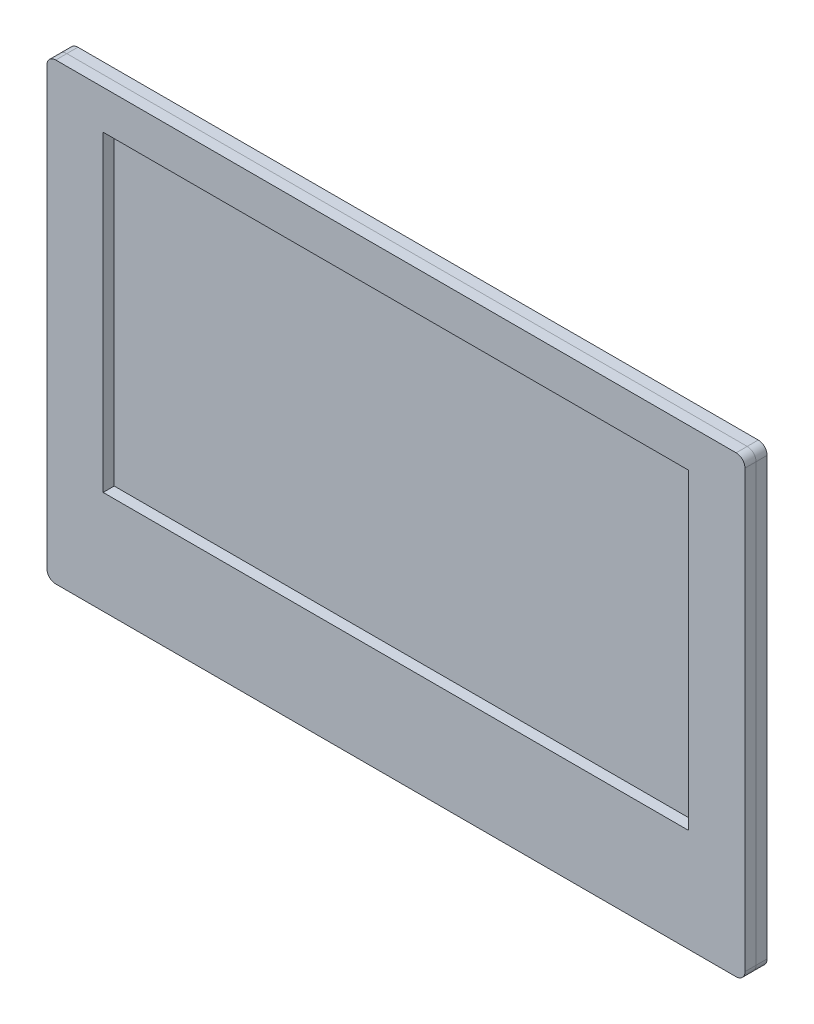
ISO-10303-21;
HEADER;
FILE_DESCRIPTION(('STEP AP214'),'2;1');
FILE_NAME('part.step','',(''),(''),'','','');
FILE_SCHEMA(('AUTOMOTIVE_DESIGN { 1 0 10303 214 1 1 1 1 }'));
ENDSEC;
DATA;
#1=APPLICATION_CONTEXT('core data for automotive mechanical design processes');
#2=APPLICATION_PROTOCOL_DEFINITION('international standard','automotive_design',2000,#1);
#3=PRODUCT_CONTEXT('',#1,'mechanical');
#4=PRODUCT('Part','Part','',(#3));
#5=PRODUCT_RELATED_PRODUCT_CATEGORY('part','',(#4));
#6=PRODUCT_DEFINITION_FORMATION('','',#4);
#7=PRODUCT_DEFINITION_CONTEXT('part definition',#1,'design');
#8=PRODUCT_DEFINITION('design','',#6,#7);
#9=PRODUCT_DEFINITION_SHAPE('','',#8);
#10=(LENGTH_UNIT() NAMED_UNIT(*) SI_UNIT(.MILLI.,.METRE.));
#11=(NAMED_UNIT(*) PLANE_ANGLE_UNIT() SI_UNIT($,.RADIAN.));
#12=(NAMED_UNIT(*) SI_UNIT($,.STERADIAN.) SOLID_ANGLE_UNIT());
#13=UNCERTAINTY_MEASURE_WITH_UNIT(LENGTH_MEASURE(1.E-05),#10,'distance_accuracy_value','');
#14=(GEOMETRIC_REPRESENTATION_CONTEXT(3) GLOBAL_UNCERTAINTY_ASSIGNED_CONTEXT((#13)) GLOBAL_UNIT_ASSIGNED_CONTEXT((#10,
#11,#12)) REPRESENTATION_CONTEXT('',''));
#15=CARTESIAN_POINT('',(0.,0.,0.));
#16=DIRECTION('',(0.,0.,1.));
#17=DIRECTION('',(1.,0.,0.));
#18=AXIS2_PLACEMENT_3D('',#15,#16,#17);
#19=CARTESIAN_POINT('',(-97.5754595620853,53.3425148073149,-4.7625));
#20=DIRECTION('',(0.,0.,1.));
#21=DIRECTION('',(1.,0.,0.));
#22=AXIS2_PLACEMENT_3D('',#19,#20,#21);
#23=CYLINDRICAL_SURFACE('',#22,2.54);
#24=CARTESIAN_POINT('',(-97.5754595620853,53.3425148073149,-1.5875));
#25=DIRECTION('',(0.,0.,-1.));
#26=DIRECTION('',(-1.,0.,0.));
#27=AXIS2_PLACEMENT_3D('',#24,#25,#26);
#28=CIRCLE('',#27,2.54);
#29=CARTESIAN_POINT('',(-100.115459562085,53.3425148073149,-1.5875));
#30=VERTEX_POINT('',#29);
#31=CARTESIAN_POINT('',(-97.5754595620853,55.8825148073149,-1.5875));
#32=VERTEX_POINT('',#31);
#33=EDGE_CURVE('E141',#30,#32,#28,.T.);
#34=ORIENTED_EDGE('',*,*,#33,.T.);
#35=DIRECTION('',(0.,0.,1.));
#36=VECTOR('',#35,1.);
#37=CARTESIAN_POINT('',(-97.5754595620853,55.8825148073149,-4.7625));
#38=LINE('',#37,#36);
#39=CARTESIAN_POINT('',(-97.5754595620853,55.8825148073149,-4.7625));
#40=VERTEX_POINT('',#39);
#41=EDGE_CURVE('E12',#40,#32,#38,.T.);
#42=ORIENTED_EDGE('',*,*,#41,.F.);
#43=CARTESIAN_POINT('',(-97.5754595620853,53.3425148073149,-4.7625));
#44=DIRECTION('',(0.,0.,-1.));
#45=DIRECTION('',(-1.,0.,0.));
#46=AXIS2_PLACEMENT_3D('',#43,#44,#45);
#47=CIRCLE('',#46,2.54);
#48=CARTESIAN_POINT('',(-100.115459562085,53.3425148073149,-4.7625));
#49=VERTEX_POINT('',#48);
#50=EDGE_CURVE('E155',#49,#40,#47,.T.);
#51=ORIENTED_EDGE('',*,*,#50,.F.);
#52=DIRECTION('',(0.,0.,1.));
#53=VECTOR('',#52,1.);
#54=CARTESIAN_POINT('',(-100.115459562085,53.3425148073149,-4.7625));
#55=LINE('',#54,#53);
#56=EDGE_CURVE('E137',#49,#30,#55,.T.);
#57=ORIENTED_EDGE('',*,*,#56,.T.);
#58=EDGE_LOOP('',(#34,#42,#51,#57));
#59=FACE_BOUND('',#58,.T.);
#60=ADVANCED_FACE('F45',(#59),#23,.T.);
#61=CARTESIAN_POINT('',(-97.5754595620853,55.8825148073149,-4.7625));
#62=DIRECTION('',(0.,-1.,0.));
#63=DIRECTION('',(0.,0.,-1.));
#64=AXIS2_PLACEMENT_3D('',#61,#62,#63);
#65=PLANE('',#64);
#66=DIRECTION('',(1.,0.,0.));
#67=VECTOR('',#66,1.);
#68=CARTESIAN_POINT('',(-97.5754595620853,55.8825148073149,-1.5875));
#69=LINE('',#68,#67);
#70=CARTESIAN_POINT('',(97.5754595620853,55.8825148073149,-1.5875));
#71=VERTEX_POINT('',#70);
#72=EDGE_CURVE('E144',#32,#71,#69,.T.);
#73=ORIENTED_EDGE('',*,*,#72,.T.);
#74=DIRECTION('',(0.,0.,1.));
#75=VECTOR('',#74,1.);
#76=CARTESIAN_POINT('',(97.5754595620853,55.8825148073149,-4.7625));
#77=LINE('',#76,#75);
#78=CARTESIAN_POINT('',(97.5754595620853,55.8825148073149,-4.7625));
#79=VERTEX_POINT('',#78);
#80=EDGE_CURVE('E53',#79,#71,#77,.T.);
#81=ORIENTED_EDGE('',*,*,#80,.F.);
#82=DIRECTION('',(1.,0.,0.));
#83=VECTOR('',#82,1.);
#84=CARTESIAN_POINT('',(-97.5754595620853,55.8825148073149,-4.7625));
#85=LINE('',#84,#83);
#86=EDGE_CURVE('E104',#40,#79,#85,.T.);
#87=ORIENTED_EDGE('',*,*,#86,.F.);
#88=ORIENTED_EDGE('',*,*,#41,.T.);
#89=EDGE_LOOP('',(#73,#81,#87,#88));
#90=FACE_BOUND('',#89,.T.);
#91=ADVANCED_FACE('F190',(#90),#65,.F.);
#92=CARTESIAN_POINT('',(97.5754595620853,53.3425148073149,-4.7625));
#93=DIRECTION('',(0.,0.,1.));
#94=DIRECTION('',(1.,0.,0.));
#95=AXIS2_PLACEMENT_3D('',#92,#93,#94);
#96=CYLINDRICAL_SURFACE('',#95,2.54000000000001);
#97=CARTESIAN_POINT('',(97.5754595620853,53.3425148073149,-1.5875));
#98=DIRECTION('',(0.,0.,-1.));
#99=DIRECTION('',(-1.,0.,0.));
#100=AXIS2_PLACEMENT_3D('',#97,#98,#99);
#101=CIRCLE('',#100,2.54000000000001);
#102=CARTESIAN_POINT('',(100.115459562085,53.3425148073149,-1.5875));
#103=VERTEX_POINT('',#102);
#104=EDGE_CURVE('E146',#71,#103,#101,.T.);
#105=ORIENTED_EDGE('',*,*,#104,.T.);
#106=DIRECTION('',(0.,0.,1.));
#107=VECTOR('',#106,1.);
#108=CARTESIAN_POINT('',(100.115459562085,53.3425148073149,-4.7625));
#109=LINE('',#108,#107);
#110=CARTESIAN_POINT('',(100.115459562085,53.3425148073149,-4.7625));
#111=VERTEX_POINT('',#110);
#112=EDGE_CURVE('E162',#111,#103,#109,.T.);
#113=ORIENTED_EDGE('',*,*,#112,.F.);
#114=CARTESIAN_POINT('',(97.5754595620853,53.3425148073149,-4.7625));
#115=DIRECTION('',(0.,0.,-1.));
#116=DIRECTION('',(-1.,0.,0.));
#117=AXIS2_PLACEMENT_3D('',#114,#115,#116);
#118=CIRCLE('',#117,2.54000000000001);
#119=EDGE_CURVE('E170',#79,#111,#118,.T.);
#120=ORIENTED_EDGE('',*,*,#119,.F.);
#121=ORIENTED_EDGE('',*,*,#80,.T.);
#122=EDGE_LOOP('',(#105,#113,#120,#121));
#123=FACE_BOUND('',#122,.T.);
#124=ADVANCED_FACE('F168',(#123),#96,.T.);
#125=CARTESIAN_POINT('',(100.115459562085,53.3425148073149,-4.7625));
#126=DIRECTION('',(-1.,0.,0.));
#127=DIRECTION('',(0.,-1.,0.));
#128=AXIS2_PLACEMENT_3D('',#125,#126,#127);
#129=PLANE('',#128);
#130=DIRECTION('',(0.,-1.,0.));
#131=VECTOR('',#130,1.);
#132=CARTESIAN_POINT('',(100.115459562085,53.3425148073149,-1.5875));
#133=LINE('',#132,#131);
#134=CARTESIAN_POINT('',(100.115459562085,-71.7421873585618,-1.5875));
#135=VERTEX_POINT('',#134);
#136=EDGE_CURVE('E148',#103,#135,#133,.T.);
#137=ORIENTED_EDGE('',*,*,#136,.T.);
#138=DIRECTION('',(0.,0.,1.));
#139=VECTOR('',#138,1.);
#140=CARTESIAN_POINT('',(100.115459562085,-71.7421873585618,-4.7625));
#141=LINE('',#140,#139);
#142=CARTESIAN_POINT('',(100.115459562085,-71.7421873585618,-4.7625));
#143=VERTEX_POINT('',#142);
#144=EDGE_CURVE('E159',#143,#135,#141,.T.);
#145=ORIENTED_EDGE('',*,*,#144,.F.);
#146=DIRECTION('',(0.,-1.,0.));
#147=VECTOR('',#146,1.);
#148=CARTESIAN_POINT('',(100.115459562085,53.3425148073149,-4.7625));
#149=LINE('',#148,#147);
#150=EDGE_CURVE('E182',#111,#143,#149,.T.);
#151=ORIENTED_EDGE('',*,*,#150,.F.);
#152=ORIENTED_EDGE('',*,*,#112,.T.);
#153=EDGE_LOOP('',(#137,#145,#151,#152));
#154=FACE_BOUND('',#153,.T.);
#155=ADVANCED_FACE('F178',(#154),#129,.F.);
#156=CARTESIAN_POINT('',(97.5754595620853,-71.7421873585618,-4.7625));
#157=DIRECTION('',(0.,0.,1.));
#158=DIRECTION('',(1.,0.,0.));
#159=AXIS2_PLACEMENT_3D('',#156,#157,#158);
#160=CYLINDRICAL_SURFACE('',#159,2.54);
#161=CARTESIAN_POINT('',(97.5754595620853,-71.7421873585618,-1.5875));
#162=DIRECTION('',(0.,0.,-1.));
#163=DIRECTION('',(-1.,0.,0.));
#164=AXIS2_PLACEMENT_3D('',#161,#162,#163);
#165=CIRCLE('',#164,2.54);
#166=CARTESIAN_POINT('',(97.5754595620853,-74.2821873585618,-1.5875));
#167=VERTEX_POINT('',#166);
#168=EDGE_CURVE('E150',#135,#167,#165,.T.);
#169=ORIENTED_EDGE('',*,*,#168,.T.);
#170=DIRECTION('',(0.,0.,1.));
#171=VECTOR('',#170,1.);
#172=CARTESIAN_POINT('',(97.5754595620853,-74.2821873585618,-4.7625));
#173=LINE('',#172,#171);
#174=CARTESIAN_POINT('',(97.5754595620853,-74.2821873585618,-4.7625));
#175=VERTEX_POINT('',#174);
#176=EDGE_CURVE('E132',#175,#167,#173,.T.);
#177=ORIENTED_EDGE('',*,*,#176,.F.);
#178=CARTESIAN_POINT('',(97.5754595620853,-71.7421873585618,-4.7625));
#179=DIRECTION('',(0.,0.,-1.));
#180=DIRECTION('',(-1.,0.,0.));
#181=AXIS2_PLACEMENT_3D('',#178,#179,#180);
#182=CIRCLE('',#181,2.54);
#183=EDGE_CURVE('E123',#143,#175,#182,.T.);
#184=ORIENTED_EDGE('',*,*,#183,.F.);
#185=ORIENTED_EDGE('',*,*,#144,.T.);
#186=EDGE_LOOP('',(#169,#177,#184,#185));
#187=FACE_BOUND('',#186,.T.);
#188=ADVANCED_FACE('F181',(#187),#160,.T.);
#189=CARTESIAN_POINT('',(97.5754595620853,-74.2821873585618,-4.7625));
#190=DIRECTION('',(0.,1.,0.));
#191=DIRECTION('',(0.,0.,1.));
#192=AXIS2_PLACEMENT_3D('',#189,#190,#191);
#193=PLANE('',#192);
#194=DIRECTION('',(-1.,0.,0.));
#195=VECTOR('',#194,1.);
#196=CARTESIAN_POINT('',(97.5754595620853,-74.2821873585618,-1.5875));
#197=LINE('',#196,#195);
#198=CARTESIAN_POINT('',(-97.5754595620853,-74.2821873585618,-1.5875));
#199=VERTEX_POINT('',#198);
#200=EDGE_CURVE('E131',#167,#199,#197,.T.);
#201=ORIENTED_EDGE('',*,*,#200,.T.);
#202=DIRECTION('',(0.,0.,1.));
#203=VECTOR('',#202,1.);
#204=CARTESIAN_POINT('',(-97.5754595620853,-74.2821873585618,-4.7625));
#205=LINE('',#204,#203);
#206=CARTESIAN_POINT('',(-97.5754595620853,-74.2821873585618,-4.7625));
#207=VERTEX_POINT('',#206);
#208=EDGE_CURVE('E128',#207,#199,#205,.T.);
#209=ORIENTED_EDGE('',*,*,#208,.F.);
#210=DIRECTION('',(-1.,0.,0.));
#211=VECTOR('',#210,1.);
#212=CARTESIAN_POINT('',(97.5754595620853,-74.2821873585618,-4.7625));
#213=LINE('',#212,#211);
#214=EDGE_CURVE('E117',#175,#207,#213,.T.);
#215=ORIENTED_EDGE('',*,*,#214,.F.);
#216=ORIENTED_EDGE('',*,*,#176,.T.);
#217=EDGE_LOOP('',(#201,#209,#215,#216));
#218=FACE_BOUND('',#217,.T.);
#219=ADVANCED_FACE('F129',(#218),#193,.F.);
#220=CARTESIAN_POINT('',(-97.5754595620853,-71.7421873585618,-4.7625));
#221=DIRECTION('',(0.,0.,1.));
#222=DIRECTION('',(1.,0.,0.));
#223=AXIS2_PLACEMENT_3D('',#220,#221,#222);
#224=CYLINDRICAL_SURFACE('',#223,2.54);
#225=CARTESIAN_POINT('',(-97.5754595620853,-71.7421873585618,-1.5875));
#226=DIRECTION('',(0.,0.,-1.));
#227=DIRECTION('',(-1.,0.,0.));
#228=AXIS2_PLACEMENT_3D('',#225,#226,#227);
#229=CIRCLE('',#228,2.54);
#230=CARTESIAN_POINT('',(-100.115459562085,-71.7421873585618,-1.5875));
#231=VERTEX_POINT('',#230);
#232=EDGE_CURVE('E90',#199,#231,#229,.T.);
#233=ORIENTED_EDGE('',*,*,#232,.T.);
#234=DIRECTION('',(0.,0.,1.));
#235=VECTOR('',#234,1.);
#236=CARTESIAN_POINT('',(-100.115459562085,-71.7421873585618,-4.7625));
#237=LINE('',#236,#235);
#238=CARTESIAN_POINT('',(-100.115459562085,-71.7421873585618,-4.7625));
#239=VERTEX_POINT('',#238);
#240=EDGE_CURVE('E133',#239,#231,#237,.T.);
#241=ORIENTED_EDGE('',*,*,#240,.F.);
#242=CARTESIAN_POINT('',(-97.5754595620853,-71.7421873585618,-4.7625));
#243=DIRECTION('',(0.,0.,-1.));
#244=DIRECTION('',(-1.,0.,0.));
#245=AXIS2_PLACEMENT_3D('',#242,#243,#244);
#246=CIRCLE('',#245,2.54);
#247=EDGE_CURVE('E121',#207,#239,#246,.T.);
#248=ORIENTED_EDGE('',*,*,#247,.F.);
#249=ORIENTED_EDGE('',*,*,#208,.T.);
#250=EDGE_LOOP('',(#233,#241,#248,#249));
#251=FACE_BOUND('',#250,.T.);
#252=ADVANCED_FACE('F135',(#251),#224,.T.);
#253=CARTESIAN_POINT('',(-100.115459562085,-71.7421873585618,-4.7625));
#254=DIRECTION('',(1.,0.,0.));
#255=DIRECTION('',(0.,1.,0.));
#256=AXIS2_PLACEMENT_3D('',#253,#254,#255);
#257=PLANE('',#256);
#258=DIRECTION('',(0.,1.,0.));
#259=VECTOR('',#258,1.);
#260=CARTESIAN_POINT('',(-100.115459562085,-71.7421873585618,-1.5875));
#261=LINE('',#260,#259);
#262=EDGE_CURVE('E96',#231,#30,#261,.T.);
#263=ORIENTED_EDGE('',*,*,#262,.T.);
#264=ORIENTED_EDGE('',*,*,#56,.F.);
#265=DIRECTION('',(0.,1.,0.));
#266=VECTOR('',#265,1.);
#267=CARTESIAN_POINT('',(-100.115459562085,-71.7421873585618,-4.7625));
#268=LINE('',#267,#266);
#269=EDGE_CURVE('E61',#239,#49,#268,.T.);
#270=ORIENTED_EDGE('',*,*,#269,.F.);
#271=ORIENTED_EDGE('',*,*,#240,.T.);
#272=EDGE_LOOP('',(#263,#264,#270,#271));
#273=FACE_BOUND('',#272,.T.);
#274=ADVANCED_FACE('F206',(#273),#257,.F.);
#275=CARTESIAN_POINT('',(-97.5754595620853,53.3425148073149,-4.7625));
#276=DIRECTION('',(0.,0.,-1.));
#277=DIRECTION('',(-1.,0.,0.));
#278=AXIS2_PLACEMENT_3D('',#275,#276,#277);
#279=PLANE('',#278);
#280=ORIENTED_EDGE('',*,*,#50,.T.);
#281=ORIENTED_EDGE('',*,*,#86,.T.);
#282=ORIENTED_EDGE('',*,*,#119,.T.);
#283=ORIENTED_EDGE('',*,*,#150,.T.);
#284=ORIENTED_EDGE('',*,*,#183,.T.);
#285=ORIENTED_EDGE('',*,*,#214,.T.);
#286=ORIENTED_EDGE('',*,*,#247,.T.);
#287=ORIENTED_EDGE('',*,*,#269,.T.);
#288=EDGE_LOOP('',(#280,#281,#282,#283,#284,#285,#286,#287));
#289=FACE_BOUND('',#288,.T.);
#290=ADVANCED_FACE('F119',(#289),#279,.T.);
#291=CARTESIAN_POINT('',(-97.5754595620853,53.3425148073149,-1.5875));
#292=DIRECTION('',(0.,0.,-1.));
#293=DIRECTION('',(-1.,0.,0.));
#294=AXIS2_PLACEMENT_3D('',#291,#292,#293);
#295=PLANE('',#294);
#296=ORIENTED_EDGE('',*,*,#33,.F.);
#297=ORIENTED_EDGE('',*,*,#262,.F.);
#298=ORIENTED_EDGE('',*,*,#232,.F.);
#299=ORIENTED_EDGE('',*,*,#200,.F.);
#300=ORIENTED_EDGE('',*,*,#168,.F.);
#301=ORIENTED_EDGE('',*,*,#136,.F.);
#302=ORIENTED_EDGE('',*,*,#104,.F.);
#303=ORIENTED_EDGE('',*,*,#72,.F.);
#304=EDGE_LOOP('',(#296,#297,#298,#299,#300,#301,#302,#303));
#305=FACE_BOUND('',#304,.T.);
#306=ADVANCED_FACE('F174',(#305),#295,.F.);
#307=CLOSED_SHELL('',(#60,#91,#124,#155,#188,#219,#252,#274,#290,#306));
#308=MANIFOLD_SOLID_BREP('B2',#307);
#309=CARTESIAN_POINT('',(0.,0.,1.5875));
#310=DIRECTION('',(0.,0.,1.));
#311=DIRECTION('',(1.,0.,0.));
#312=AXIS2_PLACEMENT_3D('',#309,#310,#311);
#313=PLANE('',#312);
#314=DIRECTION('',(1.,0.,0.));
#315=VECTOR('',#314,1.);
#316=CARTESIAN_POINT('',(-100.115459562085,-74.2821873585618,1.5875));
#317=LINE('',#316,#315);
#318=CARTESIAN_POINT('',(-97.5754595620853,-74.2821873585618,1.5875));
#319=VERTEX_POINT('',#318);
#320=CARTESIAN_POINT('',(97.5754595620853,-74.2821873585618,1.5875));
#321=VERTEX_POINT('',#320);
#322=EDGE_CURVE('E408',#319,#321,#317,.T.);
#323=ORIENTED_EDGE('',*,*,#322,.T.);
#324=CARTESIAN_POINT('',(97.5754595620853,-71.7421873585618,1.5875));
#325=DIRECTION('',(0.,0.,1.));
#326=DIRECTION('',(1.,0.,0.));
#327=AXIS2_PLACEMENT_3D('',#324,#325,#326);
#328=CIRCLE('',#327,2.54);
#329=CARTESIAN_POINT('',(100.115459562085,-71.7421873585618,1.5875));
#330=VERTEX_POINT('',#329);
#331=EDGE_CURVE('E448',#321,#330,#328,.T.);
#332=ORIENTED_EDGE('',*,*,#331,.T.);
#333=DIRECTION('',(0.,1.,0.));
#334=VECTOR('',#333,1.);
#335=CARTESIAN_POINT('',(100.115459562085,55.8825148073149,1.5875));
#336=LINE('',#335,#334);
#337=CARTESIAN_POINT('',(100.115459562085,53.3425148073149,1.5875));
#338=VERTEX_POINT('',#337);
#339=EDGE_CURVE('E412',#330,#338,#336,.T.);
#340=ORIENTED_EDGE('',*,*,#339,.T.);
#341=CARTESIAN_POINT('',(97.5754595620853,53.3425148073149,1.5875));
#342=DIRECTION('',(0.,0.,1.));
#343=DIRECTION('',(1.,0.,0.));
#344=AXIS2_PLACEMENT_3D('',#341,#342,#343);
#345=CIRCLE('',#344,2.54);
#346=CARTESIAN_POINT('',(97.5754595620853,55.8825148073149,1.5875));
#347=VERTEX_POINT('',#346);
#348=EDGE_CURVE('E294',#338,#347,#345,.T.);
#349=ORIENTED_EDGE('',*,*,#348,.T.);
#350=DIRECTION('',(-1.,0.,0.));
#351=VECTOR('',#350,1.);
#352=CARTESIAN_POINT('',(-100.115459562085,55.8825148073149,1.5875));
#353=LINE('',#352,#351);
#354=CARTESIAN_POINT('',(-97.5754595620853,55.8825148073149,1.5875));
#355=VERTEX_POINT('',#354);
#356=EDGE_CURVE('E414',#347,#355,#353,.T.);
#357=ORIENTED_EDGE('',*,*,#356,.T.);
#358=CARTESIAN_POINT('',(-97.5754595620853,53.3425148073149,1.5875));
#359=DIRECTION('',(0.,0.,1.));
#360=DIRECTION('',(1.,0.,0.));
#361=AXIS2_PLACEMENT_3D('',#358,#359,#360);
#362=CIRCLE('',#361,2.54);
#363=CARTESIAN_POINT('',(-100.115459562085,53.3425148073149,1.5875));
#364=VERTEX_POINT('',#363);
#365=EDGE_CURVE('E443',#355,#364,#362,.T.);
#366=ORIENTED_EDGE('',*,*,#365,.T.);
#367=DIRECTION('',(0.,-1.,0.));
#368=VECTOR('',#367,1.);
#369=CARTESIAN_POINT('',(-100.115459562085,55.8825148073149,1.5875));
#370=LINE('',#369,#368);
#371=CARTESIAN_POINT('',(-100.115459562085,-71.7421873585618,1.5875));
#372=VERTEX_POINT('',#371);
#373=EDGE_CURVE('E405',#364,#372,#370,.T.);
#374=ORIENTED_EDGE('',*,*,#373,.T.);
#375=CARTESIAN_POINT('',(-97.5754595620853,-71.7421873585618,1.5875));
#376=DIRECTION('',(0.,0.,1.));
#377=DIRECTION('',(1.,0.,0.));
#378=AXIS2_PLACEMENT_3D('',#375,#376,#377);
#379=CIRCLE('',#378,2.54);
#380=EDGE_CURVE('E446',#372,#319,#379,.T.);
#381=ORIENTED_EDGE('',*,*,#380,.T.);
#382=EDGE_LOOP('',(#323,#332,#340,#349,#357,#366,#374,#381));
#383=FACE_BOUND('',#382,.T.);
#384=DIRECTION('',(-1.,0.,0.));
#385=VECTOR('',#384,1.);
#386=CARTESIAN_POINT('',(-83.9851,44.742227,1.5875));
#387=LINE('',#386,#385);
#388=CARTESIAN_POINT('',(83.9851,44.742227,1.5875));
#389=VERTEX_POINT('',#388);
#390=CARTESIAN_POINT('',(-83.9851,44.742227,1.5875));
#391=VERTEX_POINT('',#390);
#392=EDGE_CURVE('E374',#389,#391,#387,.T.);
#393=ORIENTED_EDGE('',*,*,#392,.F.);
#394=DIRECTION('',(0.,1.,0.));
#395=VECTOR('',#394,1.);
#396=CARTESIAN_POINT('',(83.9851,-44.742227,1.5875));
#397=LINE('',#396,#395);
#398=CARTESIAN_POINT('',(83.9851,-44.742227,1.5875));
#399=VERTEX_POINT('',#398);
#400=EDGE_CURVE('E364',#399,#389,#397,.T.);
#401=ORIENTED_EDGE('',*,*,#400,.F.);
#402=DIRECTION('',(1.,0.,0.));
#403=VECTOR('',#402,1.);
#404=CARTESIAN_POINT('',(-83.9851,-44.742227,1.5875));
#405=LINE('',#404,#403);
#406=CARTESIAN_POINT('',(-83.9851,-44.742227,1.5875));
#407=VERTEX_POINT('',#406);
#408=EDGE_CURVE('E389',#407,#399,#405,.T.);
#409=ORIENTED_EDGE('',*,*,#408,.F.);
#410=DIRECTION('',(0.,-1.,0.));
#411=VECTOR('',#410,1.);
#412=CARTESIAN_POINT('',(-83.9851,-44.742227,1.5875));
#413=LINE('',#412,#411);
#414=EDGE_CURVE('E387',#391,#407,#413,.T.);
#415=ORIENTED_EDGE('',*,*,#414,.F.);
#416=EDGE_LOOP('',(#393,#401,#409,#415));
#417=FACE_BOUND('',#416,.T.);
#418=ADVANCED_FACE('F273',(#383,#417),#313,.T.);
#419=CARTESIAN_POINT('',(0.,0.,-1.5875));
#420=DIRECTION('',(0.,0.,1.));
#421=DIRECTION('',(1.,0.,0.));
#422=AXIS2_PLACEMENT_3D('',#419,#420,#421);
#423=PLANE('',#422);
#424=DIRECTION('',(0.,1.,0.));
#425=VECTOR('',#424,1.);
#426=CARTESIAN_POINT('',(100.115459562085,55.8825148073149,-1.5875));
#427=LINE('',#426,#425);
#428=CARTESIAN_POINT('',(100.115459562085,-71.7421873585618,-1.5875));
#429=VERTEX_POINT('',#428);
#430=CARTESIAN_POINT('',(100.115459562085,53.3425148073149,-1.5875));
#431=VERTEX_POINT('',#430);
#432=EDGE_CURVE('E422',#429,#431,#427,.T.);
#433=ORIENTED_EDGE('',*,*,#432,.F.);
#434=CARTESIAN_POINT('',(97.5754595620853,-71.7421873585618,-1.5875));
#435=DIRECTION('',(0.,0.,1.));
#436=DIRECTION('',(1.,0.,0.));
#437=AXIS2_PLACEMENT_3D('',#434,#435,#436);
#438=CIRCLE('',#437,2.54);
#439=CARTESIAN_POINT('',(97.5754595620853,-74.2821873585618,-1.5875));
#440=VERTEX_POINT('',#439);
#441=EDGE_CURVE('E436',#429,#440,#438,.F.);
#442=ORIENTED_EDGE('',*,*,#441,.T.);
#443=DIRECTION('',(1.,0.,0.));
#444=VECTOR('',#443,1.);
#445=CARTESIAN_POINT('',(-100.115459562085,-74.2821873585618,-1.5875));
#446=LINE('',#445,#444);
#447=CARTESIAN_POINT('',(-97.5754595620853,-74.2821873585618,-1.5875));
#448=VERTEX_POINT('',#447);
#449=EDGE_CURVE('E419',#448,#440,#446,.T.);
#450=ORIENTED_EDGE('',*,*,#449,.F.);
#451=CARTESIAN_POINT('',(-97.5754595620853,-71.7421873585618,-1.5875));
#452=DIRECTION('',(0.,0.,1.));
#453=DIRECTION('',(1.,0.,0.));
#454=AXIS2_PLACEMENT_3D('',#451,#452,#453);
#455=CIRCLE('',#454,2.54);
#456=CARTESIAN_POINT('',(-100.115459562085,-71.7421873585618,-1.5875));
#457=VERTEX_POINT('',#456);
#458=EDGE_CURVE('E434',#448,#457,#455,.F.);
#459=ORIENTED_EDGE('',*,*,#458,.T.);
#460=DIRECTION('',(0.,-1.,0.));
#461=VECTOR('',#460,1.);
#462=CARTESIAN_POINT('',(-100.115459562085,55.8825148073149,-1.5875));
#463=LINE('',#462,#461);
#464=CARTESIAN_POINT('',(-100.115459562085,53.3425148073149,-1.5875));
#465=VERTEX_POINT('',#464);
#466=EDGE_CURVE('E382',#465,#457,#463,.T.);
#467=ORIENTED_EDGE('',*,*,#466,.F.);
#468=CARTESIAN_POINT('',(-97.5754595620853,53.3425148073149,-1.5875));
#469=DIRECTION('',(0.,0.,1.));
#470=DIRECTION('',(1.,0.,0.));
#471=AXIS2_PLACEMENT_3D('',#468,#469,#470);
#472=CIRCLE('',#471,2.54);
#473=CARTESIAN_POINT('',(-97.5754595620853,55.8825148073149,-1.5875));
#474=VERTEX_POINT('',#473);
#475=EDGE_CURVE('E430',#465,#474,#472,.F.);
#476=ORIENTED_EDGE('',*,*,#475,.T.);
#477=DIRECTION('',(-1.,0.,0.));
#478=VECTOR('',#477,1.);
#479=CARTESIAN_POINT('',(-100.115459562085,55.8825148073149,-1.5875));
#480=LINE('',#479,#478);
#481=CARTESIAN_POINT('',(97.5754595620853,55.8825148073149,-1.5875));
#482=VERTEX_POINT('',#481);
#483=EDGE_CURVE('E409',#482,#474,#480,.T.);
#484=ORIENTED_EDGE('',*,*,#483,.F.);
#485=CARTESIAN_POINT('',(97.5754595620853,53.3425148073149,-1.5875));
#486=DIRECTION('',(0.,0.,1.));
#487=DIRECTION('',(1.,0.,0.));
#488=AXIS2_PLACEMENT_3D('',#485,#486,#487);
#489=CIRCLE('',#488,2.54);
#490=EDGE_CURVE('E432',#482,#431,#489,.F.);
#491=ORIENTED_EDGE('',*,*,#490,.T.);
#492=EDGE_LOOP('',(#433,#442,#450,#459,#467,#476,#484,#491));
#493=FACE_BOUND('',#492,.T.);
#494=DIRECTION('',(0.,1.,0.));
#495=VECTOR('',#494,1.);
#496=CARTESIAN_POINT('',(83.9851,-44.742227,-1.5875));
#497=LINE('',#496,#495);
#498=CARTESIAN_POINT('',(83.9851,-44.742227,-1.5875));
#499=VERTEX_POINT('',#498);
#500=CARTESIAN_POINT('',(83.9851,44.742227,-1.5875));
#501=VERTEX_POINT('',#500);
#502=EDGE_CURVE('E393',#499,#501,#497,.T.);
#503=ORIENTED_EDGE('',*,*,#502,.T.);
#504=DIRECTION('',(-1.,0.,0.));
#505=VECTOR('',#504,1.);
#506=CARTESIAN_POINT('',(-83.9851,44.742227,-1.5875));
#507=LINE('',#506,#505);
#508=CARTESIAN_POINT('',(-83.9851,44.742227,-1.5875));
#509=VERTEX_POINT('',#508);
#510=EDGE_CURVE('E381',#501,#509,#507,.T.);
#511=ORIENTED_EDGE('',*,*,#510,.T.);
#512=DIRECTION('',(0.,-1.,0.));
#513=VECTOR('',#512,1.);
#514=CARTESIAN_POINT('',(-83.9851,-44.742227,-1.5875));
#515=LINE('',#514,#513);
#516=CARTESIAN_POINT('',(-83.9851,-44.742227,-1.5875));
#517=VERTEX_POINT('',#516);
#518=EDGE_CURVE('E396',#509,#517,#515,.T.);
#519=ORIENTED_EDGE('',*,*,#518,.T.);
#520=DIRECTION('',(1.,0.,0.));
#521=VECTOR('',#520,1.);
#522=CARTESIAN_POINT('',(-83.9851,-44.742227,-1.5875));
#523=LINE('',#522,#521);
#524=EDGE_CURVE('E375',#517,#499,#523,.T.);
#525=ORIENTED_EDGE('',*,*,#524,.T.);
#526=EDGE_LOOP('',(#503,#511,#519,#525));
#527=FACE_BOUND('',#526,.T.);
#528=ADVANCED_FACE('F472',(#493,#527),#423,.F.);
#529=CARTESIAN_POINT('',(-100.115459562085,55.8825148073149,1.5875));
#530=DIRECTION('',(1.,0.,0.));
#531=DIRECTION('',(0.,1.,0.));
#532=AXIS2_PLACEMENT_3D('',#529,#530,#531);
#533=PLANE('',#532);
#534=ORIENTED_EDGE('',*,*,#466,.T.);
#535=DIRECTION('',(0.,0.,-1.));
#536=VECTOR('',#535,1.);
#537=CARTESIAN_POINT('',(-100.115459562085,-71.7421873585618,1.5875));
#538=LINE('',#537,#536);
#539=EDGE_CURVE('E453',#457,#372,#538,.F.);
#540=ORIENTED_EDGE('',*,*,#539,.T.);
#541=ORIENTED_EDGE('',*,*,#373,.F.);
#542=DIRECTION('',(0.,0.,-1.));
#543=VECTOR('',#542,1.);
#544=CARTESIAN_POINT('',(-100.115459562085,53.3425148073149,1.5875));
#545=LINE('',#544,#543);
#546=EDGE_CURVE('E450',#364,#465,#545,.T.);
#547=ORIENTED_EDGE('',*,*,#546,.T.);
#548=EDGE_LOOP('',(#534,#540,#541,#547));
#549=FACE_BOUND('',#548,.T.);
#550=ADVANCED_FACE('F457',(#549),#533,.F.);
#551=CARTESIAN_POINT('',(-100.115459562085,-74.2821873585618,1.5875));
#552=DIRECTION('',(0.,1.,0.));
#553=DIRECTION('',(0.,0.,1.));
#554=AXIS2_PLACEMENT_3D('',#551,#552,#553);
#555=PLANE('',#554);
#556=ORIENTED_EDGE('',*,*,#449,.T.);
#557=DIRECTION('',(0.,0.,-1.));
#558=VECTOR('',#557,1.);
#559=CARTESIAN_POINT('',(97.5754595620853,-74.2821873585618,1.5875));
#560=LINE('',#559,#558);
#561=EDGE_CURVE('E441',#440,#321,#560,.F.);
#562=ORIENTED_EDGE('',*,*,#561,.T.);
#563=ORIENTED_EDGE('',*,*,#322,.F.);
#564=DIRECTION('',(0.,0.,-1.));
#565=VECTOR('',#564,1.);
#566=CARTESIAN_POINT('',(-97.5754595620853,-74.2821873585618,1.5875));
#567=LINE('',#566,#565);
#568=EDGE_CURVE('E438',#319,#448,#567,.T.);
#569=ORIENTED_EDGE('',*,*,#568,.T.);
#570=EDGE_LOOP('',(#556,#562,#563,#569));
#571=FACE_BOUND('',#570,.T.);
#572=ADVANCED_FACE('F468',(#571),#555,.F.);
#573=CARTESIAN_POINT('',(100.115459562085,55.8825148073149,1.5875));
#574=DIRECTION('',(-1.,0.,0.));
#575=DIRECTION('',(0.,-1.,0.));
#576=AXIS2_PLACEMENT_3D('',#573,#574,#575);
#577=PLANE('',#576);
#578=ORIENTED_EDGE('',*,*,#339,.F.);
#579=DIRECTION('',(0.,0.,-1.));
#580=VECTOR('',#579,1.);
#581=CARTESIAN_POINT('',(100.115459562085,-71.7421873585618,1.5875));
#582=LINE('',#581,#580);
#583=EDGE_CURVE('E427',#330,#429,#582,.T.);
#584=ORIENTED_EDGE('',*,*,#583,.T.);
#585=ORIENTED_EDGE('',*,*,#432,.T.);
#586=DIRECTION('',(0.,0.,-1.));
#587=VECTOR('',#586,1.);
#588=CARTESIAN_POINT('',(100.115459562085,53.3425148073149,1.5875));
#589=LINE('',#588,#587);
#590=EDGE_CURVE('E416',#431,#338,#589,.F.);
#591=ORIENTED_EDGE('',*,*,#590,.T.);
#592=EDGE_LOOP('',(#578,#584,#585,#591));
#593=FACE_BOUND('',#592,.T.);
#594=ADVANCED_FACE('F480',(#593),#577,.F.);
#595=CARTESIAN_POINT('',(-100.115459562085,55.8825148073149,1.5875));
#596=DIRECTION('',(0.,-1.,0.));
#597=DIRECTION('',(0.,0.,-1.));
#598=AXIS2_PLACEMENT_3D('',#595,#596,#597);
#599=PLANE('',#598);
#600=ORIENTED_EDGE('',*,*,#356,.F.);
#601=DIRECTION('',(0.,0.,-1.));
#602=VECTOR('',#601,1.);
#603=CARTESIAN_POINT('',(97.5754595620853,55.8825148073149,1.5875));
#604=LINE('',#603,#602);
#605=EDGE_CURVE('E43',#347,#482,#604,.T.);
#606=ORIENTED_EDGE('',*,*,#605,.T.);
#607=ORIENTED_EDGE('',*,*,#483,.T.);
#608=DIRECTION('',(0.,0.,-1.));
#609=VECTOR('',#608,1.);
#610=CARTESIAN_POINT('',(-97.5754595620853,55.8825148073149,1.5875));
#611=LINE('',#610,#609);
#612=EDGE_CURVE('E281',#474,#355,#611,.F.);
#613=ORIENTED_EDGE('',*,*,#612,.T.);
#614=EDGE_LOOP('',(#600,#606,#607,#613));
#615=FACE_BOUND('',#614,.T.);
#616=ADVANCED_FACE('F486',(#615),#599,.F.);
#617=CARTESIAN_POINT('',(83.9851,-44.742227,1.5875));
#618=DIRECTION('',(-1.,0.,0.));
#619=DIRECTION('',(0.,0.,1.));
#620=AXIS2_PLACEMENT_3D('',#617,#618,#619);
#621=PLANE('',#620);
#622=ORIENTED_EDGE('',*,*,#502,.F.);
#623=DIRECTION('',(0.,0.,-1.));
#624=VECTOR('',#623,1.);
#625=CARTESIAN_POINT('',(83.9851,-44.742227,1.5875));
#626=LINE('',#625,#624);
#627=EDGE_CURVE('E370',#399,#499,#626,.T.);
#628=ORIENTED_EDGE('',*,*,#627,.F.);
#629=ORIENTED_EDGE('',*,*,#400,.T.);
#630=DIRECTION('',(0.,0.,-1.));
#631=VECTOR('',#630,1.);
#632=CARTESIAN_POINT('',(83.9851,44.742227,1.5875));
#633=LINE('',#632,#631);
#634=EDGE_CURVE('E367',#389,#501,#633,.T.);
#635=ORIENTED_EDGE('',*,*,#634,.T.);
#636=EDGE_LOOP('',(#622,#628,#629,#635));
#637=FACE_BOUND('',#636,.T.);
#638=ADVANCED_FACE('F366',(#637),#621,.T.);
#639=CARTESIAN_POINT('',(-83.9851,44.742227,1.5875));
#640=DIRECTION('',(0.,-1.,0.));
#641=DIRECTION('',(0.,0.,-1.));
#642=AXIS2_PLACEMENT_3D('',#639,#640,#641);
#643=PLANE('',#642);
#644=ORIENTED_EDGE('',*,*,#510,.F.);
#645=ORIENTED_EDGE('',*,*,#634,.F.);
#646=ORIENTED_EDGE('',*,*,#392,.T.);
#647=DIRECTION('',(0.,0.,-1.));
#648=VECTOR('',#647,1.);
#649=CARTESIAN_POINT('',(-83.9851,44.742227,1.5875));
#650=LINE('',#649,#648);
#651=EDGE_CURVE('E383',#391,#509,#650,.T.);
#652=ORIENTED_EDGE('',*,*,#651,.T.);
#653=EDGE_LOOP('',(#644,#645,#646,#652));
#654=FACE_BOUND('',#653,.T.);
#655=ADVANCED_FACE('F378',(#654),#643,.T.);
#656=CARTESIAN_POINT('',(-83.9851,-44.742227,1.5875));
#657=DIRECTION('',(1.,0.,0.));
#658=DIRECTION('',(0.,0.,-1.));
#659=AXIS2_PLACEMENT_3D('',#656,#657,#658);
#660=PLANE('',#659);
#661=ORIENTED_EDGE('',*,*,#518,.F.);
#662=ORIENTED_EDGE('',*,*,#651,.F.);
#663=ORIENTED_EDGE('',*,*,#414,.T.);
#664=DIRECTION('',(0.,0.,-1.));
#665=VECTOR('',#664,1.);
#666=CARTESIAN_POINT('',(-83.9851,-44.742227,1.5875));
#667=LINE('',#666,#665);
#668=EDGE_CURVE('E402',#407,#517,#667,.T.);
#669=ORIENTED_EDGE('',*,*,#668,.T.);
#670=EDGE_LOOP('',(#661,#662,#663,#669));
#671=FACE_BOUND('',#670,.T.);
#672=ADVANCED_FACE('F542',(#671),#660,.T.);
#673=CARTESIAN_POINT('',(-83.9851,-44.742227,1.5875));
#674=DIRECTION('',(0.,1.,0.));
#675=DIRECTION('',(0.,0.,1.));
#676=AXIS2_PLACEMENT_3D('',#673,#674,#675);
#677=PLANE('',#676);
#678=ORIENTED_EDGE('',*,*,#524,.F.);
#679=ORIENTED_EDGE('',*,*,#668,.F.);
#680=ORIENTED_EDGE('',*,*,#408,.T.);
#681=ORIENTED_EDGE('',*,*,#627,.T.);
#682=EDGE_LOOP('',(#678,#679,#680,#681));
#683=FACE_BOUND('',#682,.T.);
#684=ADVANCED_FACE('F511',(#683),#677,.T.);
#685=CARTESIAN_POINT('',(97.5754595620853,-71.7421873585618,1.5875));
#686=DIRECTION('',(0.,0.,-1.));
#687=DIRECTION('',(-1.,0.,0.));
#688=AXIS2_PLACEMENT_3D('',#685,#686,#687);
#689=CYLINDRICAL_SURFACE('',#688,2.54);
#690=ORIENTED_EDGE('',*,*,#331,.F.);
#691=ORIENTED_EDGE('',*,*,#561,.F.);
#692=ORIENTED_EDGE('',*,*,#441,.F.);
#693=ORIENTED_EDGE('',*,*,#583,.F.);
#694=EDGE_LOOP('',(#690,#691,#692,#693));
#695=FACE_BOUND('',#694,.T.);
#696=ADVANCED_FACE('F477',(#695),#689,.T.);
#697=CARTESIAN_POINT('',(-97.5754595620853,-71.7421873585618,1.5875));
#698=DIRECTION('',(0.,0.,-1.));
#699=DIRECTION('',(-1.,0.,0.));
#700=AXIS2_PLACEMENT_3D('',#697,#698,#699);
#701=CYLINDRICAL_SURFACE('',#700,2.54);
#702=ORIENTED_EDGE('',*,*,#380,.F.);
#703=ORIENTED_EDGE('',*,*,#539,.F.);
#704=ORIENTED_EDGE('',*,*,#458,.F.);
#705=ORIENTED_EDGE('',*,*,#568,.F.);
#706=EDGE_LOOP('',(#702,#703,#704,#705));
#707=FACE_BOUND('',#706,.T.);
#708=ADVANCED_FACE('F465',(#707),#701,.T.);
#709=CARTESIAN_POINT('',(97.5754595620853,53.3425148073149,1.5875));
#710=DIRECTION('',(0.,0.,-1.));
#711=DIRECTION('',(-1.,0.,0.));
#712=AXIS2_PLACEMENT_3D('',#709,#710,#711);
#713=CYLINDRICAL_SURFACE('',#712,2.54);
#714=ORIENTED_EDGE('',*,*,#348,.F.);
#715=ORIENTED_EDGE('',*,*,#590,.F.);
#716=ORIENTED_EDGE('',*,*,#490,.F.);
#717=ORIENTED_EDGE('',*,*,#605,.F.);
#718=EDGE_LOOP('',(#714,#715,#716,#717));
#719=FACE_BOUND('',#718,.T.);
#720=ADVANCED_FACE('F484',(#719),#713,.T.);
#721=CARTESIAN_POINT('',(-97.5754595620853,53.3425148073149,1.5875));
#722=DIRECTION('',(0.,0.,-1.));
#723=DIRECTION('',(-1.,0.,0.));
#724=AXIS2_PLACEMENT_3D('',#721,#722,#723);
#725=CYLINDRICAL_SURFACE('',#724,2.54);
#726=ORIENTED_EDGE('',*,*,#365,.F.);
#727=ORIENTED_EDGE('',*,*,#612,.F.);
#728=ORIENTED_EDGE('',*,*,#475,.F.);
#729=ORIENTED_EDGE('',*,*,#546,.F.);
#730=EDGE_LOOP('',(#726,#727,#728,#729));
#731=FACE_BOUND('',#730,.T.);
#732=ADVANCED_FACE('F275',(#731),#725,.T.);
#733=CLOSED_SHELL('',(#418,#528,#550,#572,#594,#616,#638,#655,#672,#684,#696,#708,#720,#732));
#734=MANIFOLD_SOLID_BREP('B6',#733);
#735=ADVANCED_BREP_SHAPE_REPRESENTATION('',(#18,#308,#734),#14);
#736=SHAPE_DEFINITION_REPRESENTATION(#9,#735);
ENDSEC;
END-ISO-10303-21;
